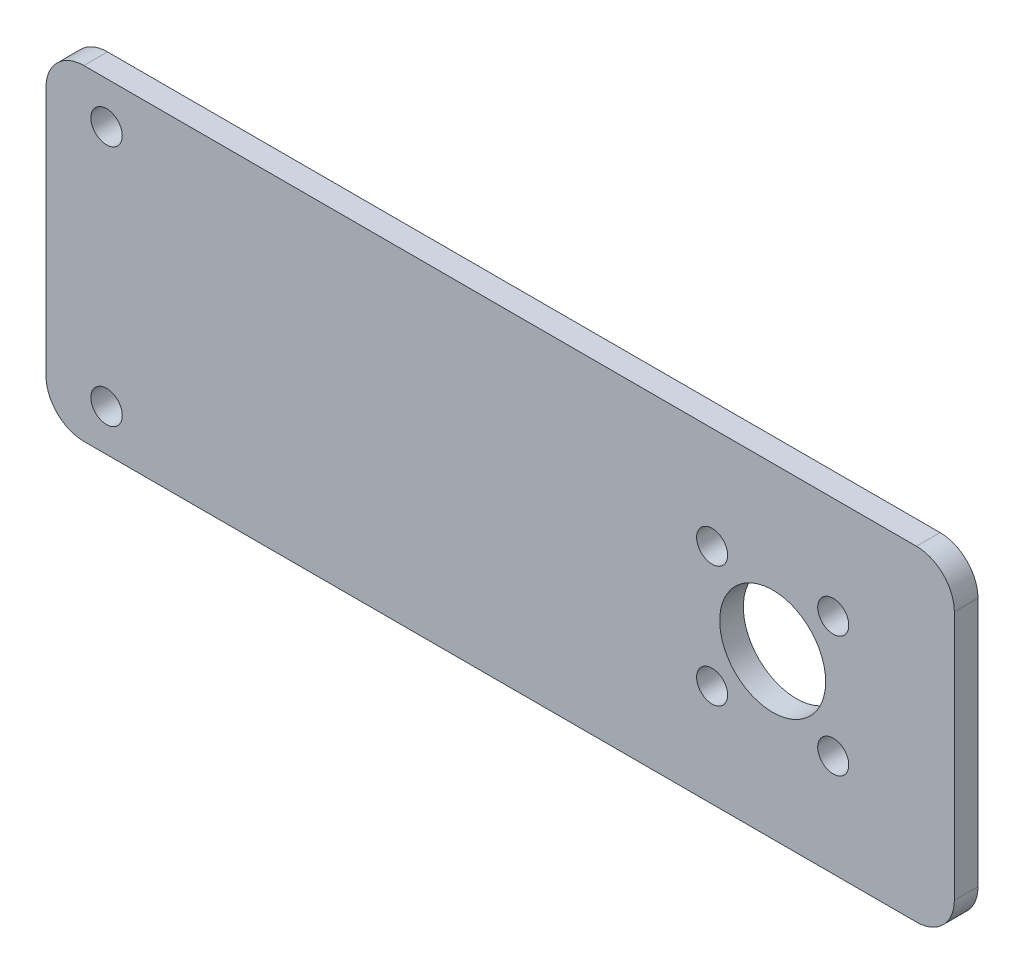
ISO-10303-21;
HEADER;
FILE_DESCRIPTION(('STEP AP214'),'2;1');
FILE_NAME('part.step','',(''),(''),'','','');
FILE_SCHEMA(('AUTOMOTIVE_DESIGN { 1 0 10303 214 1 1 1 1 }'));
ENDSEC;
DATA;
#1=APPLICATION_CONTEXT('core data for automotive mechanical design processes');
#2=APPLICATION_PROTOCOL_DEFINITION('international standard','automotive_design',2000,#1);
#3=PRODUCT_CONTEXT('',#1,'mechanical');
#4=PRODUCT('Part','Part','',(#3));
#5=PRODUCT_RELATED_PRODUCT_CATEGORY('part','',(#4));
#6=PRODUCT_DEFINITION_FORMATION('','',#4);
#7=PRODUCT_DEFINITION_CONTEXT('part definition',#1,'design');
#8=PRODUCT_DEFINITION('design','',#6,#7);
#9=PRODUCT_DEFINITION_SHAPE('','',#8);
#10=(LENGTH_UNIT() NAMED_UNIT(*) SI_UNIT(.MILLI.,.METRE.));
#11=(NAMED_UNIT(*) PLANE_ANGLE_UNIT() SI_UNIT($,.RADIAN.));
#12=(NAMED_UNIT(*) SI_UNIT($,.STERADIAN.) SOLID_ANGLE_UNIT());
#13=UNCERTAINTY_MEASURE_WITH_UNIT(LENGTH_MEASURE(1.E-05),#10,'distance_accuracy_value','');
#14=(GEOMETRIC_REPRESENTATION_CONTEXT(3) GLOBAL_UNCERTAINTY_ASSIGNED_CONTEXT((#13)) GLOBAL_UNIT_ASSIGNED_CONTEXT((#10,
#11,#12)) REPRESENTATION_CONTEXT('',''));
#15=CARTESIAN_POINT('',(0.,0.,0.));
#16=DIRECTION('',(0.,0.,1.));
#17=DIRECTION('',(1.,0.,0.));
#18=AXIS2_PLACEMENT_3D('',#15,#16,#17);
#19=CARTESIAN_POINT('',(0.,0.,3.125));
#20=DIRECTION('',(0.,0.,1.));
#21=DIRECTION('',(1.,0.,0.));
#22=AXIS2_PLACEMENT_3D('',#19,#20,#21);
#23=PLANE('',#22);
#24=CARTESIAN_POINT('',(44.,-8.00000000000001,3.125));
#25=DIRECTION('',(0.,0.,1.));
#26=DIRECTION('',(1.,0.,0.));
#27=AXIS2_PLACEMENT_3D('',#24,#25,#26);
#28=CIRCLE('',#27,2.05);
#29=CARTESIAN_POINT('',(46.05,-8.00000000000001,3.125));
#30=VERTEX_POINT('',#29);
#31=EDGE_CURVE('E199',#30,#30,#28,.T.);
#32=ORIENTED_EDGE('',*,*,#31,.F.);
#33=EDGE_LOOP('',(#32));
#34=FACE_BOUND('',#33,.T.);
#35=CARTESIAN_POINT('',(28.,7.99999999999999,3.125));
#36=DIRECTION('',(0.,0.,1.));
#37=DIRECTION('',(1.,0.,0.));
#38=AXIS2_PLACEMENT_3D('',#35,#36,#37);
#39=CIRCLE('',#38,2.05);
#40=CARTESIAN_POINT('',(30.05,7.99999999999999,3.125));
#41=VERTEX_POINT('',#40);
#42=EDGE_CURVE('E187',#41,#41,#39,.T.);
#43=ORIENTED_EDGE('',*,*,#42,.F.);
#44=EDGE_LOOP('',(#43));
#45=FACE_BOUND('',#44,.T.);
#46=CARTESIAN_POINT('',(-52.,-16.,3.125));
#47=DIRECTION('',(0.,0.,1.));
#48=DIRECTION('',(1.,0.,0.));
#49=AXIS2_PLACEMENT_3D('',#46,#47,#48);
#50=CIRCLE('',#49,2.075);
#51=CARTESIAN_POINT('',(-49.925,-16.,3.125));
#52=VERTEX_POINT('',#51);
#53=EDGE_CURVE('E176',#52,#52,#50,.T.);
#54=ORIENTED_EDGE('',*,*,#53,.F.);
#55=EDGE_LOOP('',(#54));
#56=FACE_BOUND('',#55,.T.);
#57=DIRECTION('',(1.,0.,0.));
#58=VECTOR('',#57,1.);
#59=CARTESIAN_POINT('',(60.,-21.5,3.125));
#60=LINE('',#59,#58);
#61=CARTESIAN_POINT('',(-55.,-21.5,3.125));
#62=VERTEX_POINT('',#61);
#63=CARTESIAN_POINT('',(55.,-21.5,3.125));
#64=VERTEX_POINT('',#63);
#65=EDGE_CURVE('E171',#62,#64,#60,.T.);
#66=ORIENTED_EDGE('',*,*,#65,.T.);
#67=CARTESIAN_POINT('',(55.,-16.5,3.125));
#68=DIRECTION('',(0.,0.,1.));
#69=DIRECTION('',(1.,0.,0.));
#70=AXIS2_PLACEMENT_3D('',#67,#68,#69);
#71=CIRCLE('',#70,5.);
#72=CARTESIAN_POINT('',(60.,-16.5,3.125));
#73=VERTEX_POINT('',#72);
#74=EDGE_CURVE('E148',#64,#73,#71,.T.);
#75=ORIENTED_EDGE('',*,*,#74,.T.);
#76=DIRECTION('',(0.,1.,0.));
#77=VECTOR('',#76,1.);
#78=CARTESIAN_POINT('',(60.,-21.5,3.125));
#79=LINE('',#78,#77);
#80=CARTESIAN_POINT('',(60.,16.5,3.125));
#81=VERTEX_POINT('',#80);
#82=EDGE_CURVE('E118',#73,#81,#79,.T.);
#83=ORIENTED_EDGE('',*,*,#82,.T.);
#84=CARTESIAN_POINT('',(55.,16.5,3.125));
#85=DIRECTION('',(0.,0.,1.));
#86=DIRECTION('',(1.,0.,0.));
#87=AXIS2_PLACEMENT_3D('',#84,#85,#86);
#88=CIRCLE('',#87,5.);
#89=CARTESIAN_POINT('',(55.,21.5,3.125));
#90=VERTEX_POINT('',#89);
#91=EDGE_CURVE('E55',#81,#90,#88,.T.);
#92=ORIENTED_EDGE('',*,*,#91,.T.);
#93=DIRECTION('',(-1.,0.,0.));
#94=VECTOR('',#93,1.);
#95=CARTESIAN_POINT('',(60.,21.5,3.125));
#96=LINE('',#95,#94);
#97=CARTESIAN_POINT('',(-55.,21.5,3.125));
#98=VERTEX_POINT('',#97);
#99=EDGE_CURVE('E134',#90,#98,#96,.T.);
#100=ORIENTED_EDGE('',*,*,#99,.T.);
#101=CARTESIAN_POINT('',(-55.,16.5,3.125));
#102=DIRECTION('',(0.,0.,1.));
#103=DIRECTION('',(1.,0.,0.));
#104=AXIS2_PLACEMENT_3D('',#101,#102,#103);
#105=CIRCLE('',#104,5.);
#106=CARTESIAN_POINT('',(-60.,16.5,3.125));
#107=VERTEX_POINT('',#106);
#108=EDGE_CURVE('E143',#98,#107,#105,.T.);
#109=ORIENTED_EDGE('',*,*,#108,.T.);
#110=DIRECTION('',(0.,-1.,0.));
#111=VECTOR('',#110,1.);
#112=CARTESIAN_POINT('',(-60.,-21.5,3.125));
#113=LINE('',#112,#111);
#114=CARTESIAN_POINT('',(-60.,-16.5,3.125));
#115=VERTEX_POINT('',#114);
#116=EDGE_CURVE('E128',#107,#115,#113,.T.);
#117=ORIENTED_EDGE('',*,*,#116,.T.);
#118=CARTESIAN_POINT('',(-55.,-16.5,3.125));
#119=DIRECTION('',(0.,0.,1.));
#120=DIRECTION('',(1.,0.,0.));
#121=AXIS2_PLACEMENT_3D('',#118,#119,#120);
#122=CIRCLE('',#121,5.);
#123=EDGE_CURVE('E145',#115,#62,#122,.T.);
#124=ORIENTED_EDGE('',*,*,#123,.T.);
#125=EDGE_LOOP('',(#66,#75,#83,#92,#100,#109,#117,#124));
#126=FACE_BOUND('',#125,.T.);
#127=CARTESIAN_POINT('',(-52.,16.,3.125));
#128=DIRECTION('',(0.,0.,1.));
#129=DIRECTION('',(1.,0.,0.));
#130=AXIS2_PLACEMENT_3D('',#127,#128,#129);
#131=CIRCLE('',#130,2.075);
#132=CARTESIAN_POINT('',(-49.925,16.,3.125));
#133=VERTEX_POINT('',#132);
#134=EDGE_CURVE('E164',#133,#133,#131,.T.);
#135=ORIENTED_EDGE('',*,*,#134,.F.);
#136=EDGE_LOOP('',(#135));
#137=FACE_BOUND('',#136,.T.);
#138=CARTESIAN_POINT('',(36.,0.,3.125));
#139=DIRECTION('',(0.,0.,1.));
#140=DIRECTION('',(1.,0.,0.));
#141=AXIS2_PLACEMENT_3D('',#138,#139,#140);
#142=CIRCLE('',#141,7.);
#143=CARTESIAN_POINT('',(43.,0.,3.125));
#144=VERTEX_POINT('',#143);
#145=EDGE_CURVE('E181',#144,#144,#142,.T.);
#146=ORIENTED_EDGE('',*,*,#145,.F.);
#147=EDGE_LOOP('',(#146));
#148=FACE_BOUND('',#147,.T.);
#149=CARTESIAN_POINT('',(44.,7.99999999999999,3.125));
#150=DIRECTION('',(0.,0.,1.));
#151=DIRECTION('',(1.,0.,0.));
#152=AXIS2_PLACEMENT_3D('',#149,#150,#151);
#153=CIRCLE('',#152,2.05);
#154=CARTESIAN_POINT('',(46.05,7.99999999999999,3.125));
#155=VERTEX_POINT('',#154);
#156=EDGE_CURVE('E193',#155,#155,#153,.T.);
#157=ORIENTED_EDGE('',*,*,#156,.F.);
#158=EDGE_LOOP('',(#157));
#159=FACE_BOUND('',#158,.T.);
#160=CARTESIAN_POINT('',(28.,-8.00000000000001,3.125));
#161=DIRECTION('',(0.,0.,1.));
#162=DIRECTION('',(1.,0.,0.));
#163=AXIS2_PLACEMENT_3D('',#160,#161,#162);
#164=CIRCLE('',#163,2.05);
#165=CARTESIAN_POINT('',(30.05,-8.00000000000001,3.125));
#166=VERTEX_POINT('',#165);
#167=EDGE_CURVE('E205',#166,#166,#164,.T.);
#168=ORIENTED_EDGE('',*,*,#167,.F.);
#169=EDGE_LOOP('',(#168));
#170=FACE_BOUND('',#169,.T.);
#171=ADVANCED_FACE('F33',(#34,#45,#56,#126,#137,#148,#159,#170),#23,.T.);
#172=CARTESIAN_POINT('',(0.,0.,0.));
#173=DIRECTION('',(0.,0.,1.));
#174=DIRECTION('',(1.,0.,0.));
#175=AXIS2_PLACEMENT_3D('',#172,#173,#174);
#176=PLANE('',#175);
#177=DIRECTION('',(0.,1.,0.));
#178=VECTOR('',#177,1.);
#179=CARTESIAN_POINT('',(60.,-21.5,0.));
#180=LINE('',#179,#178);
#181=CARTESIAN_POINT('',(60.,-16.5,0.));
#182=VERTEX_POINT('',#181);
#183=CARTESIAN_POINT('',(60.,16.5,0.));
#184=VERTEX_POINT('',#183);
#185=EDGE_CURVE('E116',#182,#184,#180,.T.);
#186=ORIENTED_EDGE('',*,*,#185,.F.);
#187=CARTESIAN_POINT('',(55.,-16.5,0.));
#188=DIRECTION('',(0.,0.,1.));
#189=DIRECTION('',(1.,0.,0.));
#190=AXIS2_PLACEMENT_3D('',#187,#188,#189);
#191=CIRCLE('',#190,5.);
#192=CARTESIAN_POINT('',(55.,-21.5,0.));
#193=VERTEX_POINT('',#192);
#194=EDGE_CURVE('E99',#182,#193,#191,.F.);
#195=ORIENTED_EDGE('',*,*,#194,.T.);
#196=DIRECTION('',(1.,0.,0.));
#197=VECTOR('',#196,1.);
#198=CARTESIAN_POINT('',(60.,-21.5,0.));
#199=LINE('',#198,#197);
#200=CARTESIAN_POINT('',(-55.,-21.5,0.));
#201=VERTEX_POINT('',#200);
#202=EDGE_CURVE('E126',#201,#193,#199,.T.);
#203=ORIENTED_EDGE('',*,*,#202,.F.);
#204=CARTESIAN_POINT('',(-55.,-16.5,0.));
#205=DIRECTION('',(0.,0.,1.));
#206=DIRECTION('',(1.,0.,0.));
#207=AXIS2_PLACEMENT_3D('',#204,#205,#206);
#208=CIRCLE('',#207,5.);
#209=CARTESIAN_POINT('',(-60.,-16.5,0.));
#210=VERTEX_POINT('',#209);
#211=EDGE_CURVE('E137',#201,#210,#208,.F.);
#212=ORIENTED_EDGE('',*,*,#211,.T.);
#213=DIRECTION('',(0.,-1.,0.));
#214=VECTOR('',#213,1.);
#215=CARTESIAN_POINT('',(-60.,-21.5,0.));
#216=LINE('',#215,#214);
#217=CARTESIAN_POINT('',(-60.,16.5,0.));
#218=VERTEX_POINT('',#217);
#219=EDGE_CURVE('E130',#218,#210,#216,.T.);
#220=ORIENTED_EDGE('',*,*,#219,.F.);
#221=CARTESIAN_POINT('',(-55.,16.5,0.));
#222=DIRECTION('',(0.,0.,1.));
#223=DIRECTION('',(1.,0.,0.));
#224=AXIS2_PLACEMENT_3D('',#221,#222,#223);
#225=CIRCLE('',#224,5.);
#226=CARTESIAN_POINT('',(-55.,21.5,0.));
#227=VERTEX_POINT('',#226);
#228=EDGE_CURVE('E119',#218,#227,#225,.F.);
#229=ORIENTED_EDGE('',*,*,#228,.T.);
#230=DIRECTION('',(-1.,0.,0.));
#231=VECTOR('',#230,1.);
#232=CARTESIAN_POINT('',(60.,21.5,0.));
#233=LINE('',#232,#231);
#234=CARTESIAN_POINT('',(55.,21.5,0.));
#235=VERTEX_POINT('',#234);
#236=EDGE_CURVE('E125',#235,#227,#233,.T.);
#237=ORIENTED_EDGE('',*,*,#236,.F.);
#238=CARTESIAN_POINT('',(55.,16.5,0.));
#239=DIRECTION('',(0.,0.,1.));
#240=DIRECTION('',(1.,0.,0.));
#241=AXIS2_PLACEMENT_3D('',#238,#239,#240);
#242=CIRCLE('',#241,5.);
#243=EDGE_CURVE('E110',#235,#184,#242,.F.);
#244=ORIENTED_EDGE('',*,*,#243,.T.);
#245=EDGE_LOOP('',(#186,#195,#203,#212,#220,#229,#237,#244));
#246=FACE_BOUND('',#245,.T.);
#247=CARTESIAN_POINT('',(-52.,16.,0.));
#248=DIRECTION('',(0.,0.,1.));
#249=DIRECTION('',(1.,0.,0.));
#250=AXIS2_PLACEMENT_3D('',#247,#248,#249);
#251=CIRCLE('',#250,2.075);
#252=CARTESIAN_POINT('',(-49.925,16.,0.));
#253=VERTEX_POINT('',#252);
#254=EDGE_CURVE('E166',#253,#253,#251,.T.);
#255=ORIENTED_EDGE('',*,*,#254,.T.);
#256=EDGE_LOOP('',(#255));
#257=FACE_BOUND('',#256,.T.);
#258=CARTESIAN_POINT('',(-52.,-16.,0.));
#259=DIRECTION('',(0.,0.,1.));
#260=DIRECTION('',(1.,0.,0.));
#261=AXIS2_PLACEMENT_3D('',#258,#259,#260);
#262=CIRCLE('',#261,2.075);
#263=CARTESIAN_POINT('',(-49.925,-16.,0.));
#264=VERTEX_POINT('',#263);
#265=EDGE_CURVE('E178',#264,#264,#262,.T.);
#266=ORIENTED_EDGE('',*,*,#265,.T.);
#267=EDGE_LOOP('',(#266));
#268=FACE_BOUND('',#267,.T.);
#269=CARTESIAN_POINT('',(36.,0.,0.));
#270=DIRECTION('',(0.,0.,1.));
#271=DIRECTION('',(1.,0.,0.));
#272=AXIS2_PLACEMENT_3D('',#269,#270,#271);
#273=CIRCLE('',#272,7.);
#274=CARTESIAN_POINT('',(43.,0.,0.));
#275=VERTEX_POINT('',#274);
#276=EDGE_CURVE('E184',#275,#275,#273,.T.);
#277=ORIENTED_EDGE('',*,*,#276,.T.);
#278=EDGE_LOOP('',(#277));
#279=FACE_BOUND('',#278,.T.);
#280=CARTESIAN_POINT('',(28.,7.99999999999999,0.));
#281=DIRECTION('',(0.,0.,1.));
#282=DIRECTION('',(1.,0.,0.));
#283=AXIS2_PLACEMENT_3D('',#280,#281,#282);
#284=CIRCLE('',#283,2.05);
#285=CARTESIAN_POINT('',(30.05,7.99999999999999,0.));
#286=VERTEX_POINT('',#285);
#287=EDGE_CURVE('E190',#286,#286,#284,.T.);
#288=ORIENTED_EDGE('',*,*,#287,.T.);
#289=EDGE_LOOP('',(#288));
#290=FACE_BOUND('',#289,.T.);
#291=CARTESIAN_POINT('',(44.,7.99999999999999,0.));
#292=DIRECTION('',(0.,0.,1.));
#293=DIRECTION('',(1.,0.,0.));
#294=AXIS2_PLACEMENT_3D('',#291,#292,#293);
#295=CIRCLE('',#294,2.05);
#296=CARTESIAN_POINT('',(46.05,7.99999999999999,0.));
#297=VERTEX_POINT('',#296);
#298=EDGE_CURVE('E196',#297,#297,#295,.T.);
#299=ORIENTED_EDGE('',*,*,#298,.T.);
#300=EDGE_LOOP('',(#299));
#301=FACE_BOUND('',#300,.T.);
#302=CARTESIAN_POINT('',(44.,-8.00000000000001,0.));
#303=DIRECTION('',(0.,0.,1.));
#304=DIRECTION('',(1.,0.,0.));
#305=AXIS2_PLACEMENT_3D('',#302,#303,#304);
#306=CIRCLE('',#305,2.05);
#307=CARTESIAN_POINT('',(46.05,-8.00000000000001,0.));
#308=VERTEX_POINT('',#307);
#309=EDGE_CURVE('E202',#308,#308,#306,.T.);
#310=ORIENTED_EDGE('',*,*,#309,.T.);
#311=EDGE_LOOP('',(#310));
#312=FACE_BOUND('',#311,.T.);
#313=CARTESIAN_POINT('',(28.,-8.00000000000001,0.));
#314=DIRECTION('',(0.,0.,1.));
#315=DIRECTION('',(1.,0.,0.));
#316=AXIS2_PLACEMENT_3D('',#313,#314,#315);
#317=CIRCLE('',#316,2.05);
#318=CARTESIAN_POINT('',(30.05,-8.00000000000001,0.));
#319=VERTEX_POINT('',#318);
#320=EDGE_CURVE('E208',#319,#319,#317,.T.);
#321=ORIENTED_EDGE('',*,*,#320,.T.);
#322=EDGE_LOOP('',(#321));
#323=FACE_BOUND('',#322,.T.);
#324=ADVANCED_FACE('F122',(#246,#257,#268,#279,#290,#301,#312,#323),#176,.F.);
#325=CARTESIAN_POINT('',(-60.,-21.5,3.125));
#326=DIRECTION('',(1.,0.,0.));
#327=DIRECTION('',(0.,0.,-1.));
#328=AXIS2_PLACEMENT_3D('',#325,#326,#327);
#329=PLANE('',#328);
#330=ORIENTED_EDGE('',*,*,#219,.T.);
#331=DIRECTION('',(0.,0.,-1.));
#332=VECTOR('',#331,1.);
#333=CARTESIAN_POINT('',(-60.,-16.5,3.125));
#334=LINE('',#333,#332);
#335=EDGE_CURVE('E11',#210,#115,#334,.F.);
#336=ORIENTED_EDGE('',*,*,#335,.T.);
#337=ORIENTED_EDGE('',*,*,#116,.F.);
#338=DIRECTION('',(0.,0.,-1.));
#339=VECTOR('',#338,1.);
#340=CARTESIAN_POINT('',(-60.,16.5,3.125));
#341=LINE('',#340,#339);
#342=EDGE_CURVE('E41',#107,#218,#341,.T.);
#343=ORIENTED_EDGE('',*,*,#342,.T.);
#344=EDGE_LOOP('',(#330,#336,#337,#343));
#345=FACE_BOUND('',#344,.T.);
#346=ADVANCED_FACE('F159',(#345),#329,.F.);
#347=CARTESIAN_POINT('',(60.,-21.5,3.125));
#348=DIRECTION('',(0.,1.,0.));
#349=DIRECTION('',(0.,0.,1.));
#350=AXIS2_PLACEMENT_3D('',#347,#348,#349);
#351=PLANE('',#350);
#352=ORIENTED_EDGE('',*,*,#202,.T.);
#353=DIRECTION('',(0.,0.,-1.));
#354=VECTOR('',#353,1.);
#355=CARTESIAN_POINT('',(55.,-21.5,3.125));
#356=LINE('',#355,#354);
#357=EDGE_CURVE('E104',#193,#64,#356,.F.);
#358=ORIENTED_EDGE('',*,*,#357,.T.);
#359=ORIENTED_EDGE('',*,*,#65,.F.);
#360=DIRECTION('',(0.,0.,-1.));
#361=VECTOR('',#360,1.);
#362=CARTESIAN_POINT('',(-55.,-21.5,3.125));
#363=LINE('',#362,#361);
#364=EDGE_CURVE('E109',#62,#201,#363,.T.);
#365=ORIENTED_EDGE('',*,*,#364,.T.);
#366=EDGE_LOOP('',(#352,#358,#359,#365));
#367=FACE_BOUND('',#366,.T.);
#368=ADVANCED_FACE('F235',(#367),#351,.F.);
#369=CARTESIAN_POINT('',(60.,-21.5,3.125));
#370=DIRECTION('',(-1.,0.,0.));
#371=DIRECTION('',(0.,0.,1.));
#372=AXIS2_PLACEMENT_3D('',#369,#370,#371);
#373=PLANE('',#372);
#374=ORIENTED_EDGE('',*,*,#82,.F.);
#375=DIRECTION('',(0.,0.,-1.));
#376=VECTOR('',#375,1.);
#377=CARTESIAN_POINT('',(60.,-16.5,3.125));
#378=LINE('',#377,#376);
#379=EDGE_CURVE('E103',#73,#182,#378,.T.);
#380=ORIENTED_EDGE('',*,*,#379,.T.);
#381=ORIENTED_EDGE('',*,*,#185,.T.);
#382=DIRECTION('',(0.,0.,-1.));
#383=VECTOR('',#382,1.);
#384=CARTESIAN_POINT('',(60.,16.5,3.125));
#385=LINE('',#384,#383);
#386=EDGE_CURVE('E120',#184,#81,#385,.F.);
#387=ORIENTED_EDGE('',*,*,#386,.T.);
#388=EDGE_LOOP('',(#374,#380,#381,#387));
#389=FACE_BOUND('',#388,.T.);
#390=ADVANCED_FACE('F115',(#389),#373,.F.);
#391=CARTESIAN_POINT('',(60.,21.5,3.125));
#392=DIRECTION('',(0.,-1.,0.));
#393=DIRECTION('',(0.,0.,-1.));
#394=AXIS2_PLACEMENT_3D('',#391,#392,#393);
#395=PLANE('',#394);
#396=ORIENTED_EDGE('',*,*,#99,.F.);
#397=DIRECTION('',(0.,0.,-1.));
#398=VECTOR('',#397,1.);
#399=CARTESIAN_POINT('',(55.,21.5,3.125));
#400=LINE('',#399,#398);
#401=EDGE_CURVE('E151',#90,#235,#400,.T.);
#402=ORIENTED_EDGE('',*,*,#401,.T.);
#403=ORIENTED_EDGE('',*,*,#236,.T.);
#404=DIRECTION('',(0.,0.,-1.));
#405=VECTOR('',#404,1.);
#406=CARTESIAN_POINT('',(-55.,21.5,3.125));
#407=LINE('',#406,#405);
#408=EDGE_CURVE('E48',#227,#98,#407,.F.);
#409=ORIENTED_EDGE('',*,*,#408,.T.);
#410=EDGE_LOOP('',(#396,#402,#403,#409));
#411=FACE_BOUND('',#410,.T.);
#412=ADVANCED_FACE('F230',(#411),#395,.F.);
#413=CARTESIAN_POINT('',(-52.,16.,3.125));
#414=DIRECTION('',(0.,0.,-1.));
#415=DIRECTION('',(-1.,0.,0.));
#416=AXIS2_PLACEMENT_3D('',#413,#414,#415);
#417=CYLINDRICAL_SURFACE('',#416,2.075);
#418=ORIENTED_EDGE('',*,*,#134,.T.);
#419=EDGE_LOOP('',(#418));
#420=FACE_BOUND('',#419,.T.);
#421=ORIENTED_EDGE('',*,*,#254,.F.);
#422=EDGE_LOOP('',(#421));
#423=FACE_BOUND('',#422,.T.);
#424=ADVANCED_FACE('F227',(#420,#423),#417,.F.);
#425=CARTESIAN_POINT('',(-52.,-16.,3.125));
#426=DIRECTION('',(0.,0.,-1.));
#427=DIRECTION('',(-1.,0.,0.));
#428=AXIS2_PLACEMENT_3D('',#425,#426,#427);
#429=CYLINDRICAL_SURFACE('',#428,2.075);
#430=ORIENTED_EDGE('',*,*,#53,.T.);
#431=EDGE_LOOP('',(#430));
#432=FACE_BOUND('',#431,.T.);
#433=ORIENTED_EDGE('',*,*,#265,.F.);
#434=EDGE_LOOP('',(#433));
#435=FACE_BOUND('',#434,.T.);
#436=ADVANCED_FACE('F288',(#432,#435),#429,.F.);
#437=CARTESIAN_POINT('',(36.,0.,3.125));
#438=DIRECTION('',(0.,0.,-1.));
#439=DIRECTION('',(-1.,0.,0.));
#440=AXIS2_PLACEMENT_3D('',#437,#438,#439);
#441=CYLINDRICAL_SURFACE('',#440,7.);
#442=ORIENTED_EDGE('',*,*,#145,.T.);
#443=EDGE_LOOP('',(#442));
#444=FACE_BOUND('',#443,.T.);
#445=ORIENTED_EDGE('',*,*,#276,.F.);
#446=EDGE_LOOP('',(#445));
#447=FACE_BOUND('',#446,.T.);
#448=ADVANCED_FACE('F285',(#444,#447),#441,.F.);
#449=CARTESIAN_POINT('',(28.,7.99999999999999,3.125));
#450=DIRECTION('',(0.,0.,-1.));
#451=DIRECTION('',(-1.,0.,0.));
#452=AXIS2_PLACEMENT_3D('',#449,#450,#451);
#453=CYLINDRICAL_SURFACE('',#452,2.05);
#454=ORIENTED_EDGE('',*,*,#42,.T.);
#455=EDGE_LOOP('',(#454));
#456=FACE_BOUND('',#455,.T.);
#457=ORIENTED_EDGE('',*,*,#287,.F.);
#458=EDGE_LOOP('',(#457));
#459=FACE_BOUND('',#458,.T.);
#460=ADVANCED_FACE('F267',(#456,#459),#453,.F.);
#461=CARTESIAN_POINT('',(44.,7.99999999999999,3.125));
#462=DIRECTION('',(0.,0.,-1.));
#463=DIRECTION('',(-1.,0.,0.));
#464=AXIS2_PLACEMENT_3D('',#461,#462,#463);
#465=CYLINDRICAL_SURFACE('',#464,2.05);
#466=ORIENTED_EDGE('',*,*,#156,.T.);
#467=EDGE_LOOP('',(#466));
#468=FACE_BOUND('',#467,.T.);
#469=ORIENTED_EDGE('',*,*,#298,.F.);
#470=EDGE_LOOP('',(#469));
#471=FACE_BOUND('',#470,.T.);
#472=ADVANCED_FACE('F263',(#468,#471),#465,.F.);
#473=CARTESIAN_POINT('',(44.,-8.00000000000001,3.125));
#474=DIRECTION('',(0.,0.,-1.));
#475=DIRECTION('',(-1.,0.,0.));
#476=AXIS2_PLACEMENT_3D('',#473,#474,#475);
#477=CYLINDRICAL_SURFACE('',#476,2.05);
#478=ORIENTED_EDGE('',*,*,#31,.T.);
#479=EDGE_LOOP('',(#478));
#480=FACE_BOUND('',#479,.T.);
#481=ORIENTED_EDGE('',*,*,#309,.F.);
#482=EDGE_LOOP('',(#481));
#483=FACE_BOUND('',#482,.T.);
#484=ADVANCED_FACE('F266',(#480,#483),#477,.F.);
#485=CARTESIAN_POINT('',(28.,-8.00000000000001,3.125));
#486=DIRECTION('',(0.,0.,-1.));
#487=DIRECTION('',(-1.,0.,0.));
#488=AXIS2_PLACEMENT_3D('',#485,#486,#487);
#489=CYLINDRICAL_SURFACE('',#488,2.05);
#490=ORIENTED_EDGE('',*,*,#167,.T.);
#491=EDGE_LOOP('',(#490));
#492=FACE_BOUND('',#491,.T.);
#493=ORIENTED_EDGE('',*,*,#320,.F.);
#494=EDGE_LOOP('',(#493));
#495=FACE_BOUND('',#494,.T.);
#496=ADVANCED_FACE('F214',(#492,#495),#489,.F.);
#497=CARTESIAN_POINT('',(55.,-16.5,3.125));
#498=DIRECTION('',(0.,0.,-1.));
#499=DIRECTION('',(-1.,0.,0.));
#500=AXIS2_PLACEMENT_3D('',#497,#498,#499);
#501=CYLINDRICAL_SURFACE('',#500,5.);
#502=ORIENTED_EDGE('',*,*,#74,.F.);
#503=ORIENTED_EDGE('',*,*,#357,.F.);
#504=ORIENTED_EDGE('',*,*,#194,.F.);
#505=ORIENTED_EDGE('',*,*,#379,.F.);
#506=EDGE_LOOP('',(#502,#503,#504,#505));
#507=FACE_BOUND('',#506,.T.);
#508=ADVANCED_FACE('F102',(#507),#501,.T.);
#509=CARTESIAN_POINT('',(55.,16.5,3.125));
#510=DIRECTION('',(0.,0.,-1.));
#511=DIRECTION('',(-1.,0.,0.));
#512=AXIS2_PLACEMENT_3D('',#509,#510,#511);
#513=CYLINDRICAL_SURFACE('',#512,5.);
#514=ORIENTED_EDGE('',*,*,#91,.F.);
#515=ORIENTED_EDGE('',*,*,#386,.F.);
#516=ORIENTED_EDGE('',*,*,#243,.F.);
#517=ORIENTED_EDGE('',*,*,#401,.F.);
#518=EDGE_LOOP('',(#514,#515,#516,#517));
#519=FACE_BOUND('',#518,.T.);
#520=ADVANCED_FACE('F243',(#519),#513,.T.);
#521=CARTESIAN_POINT('',(-55.,-16.5,3.125));
#522=DIRECTION('',(0.,0.,-1.));
#523=DIRECTION('',(-1.,0.,0.));
#524=AXIS2_PLACEMENT_3D('',#521,#522,#523);
#525=CYLINDRICAL_SURFACE('',#524,5.);
#526=ORIENTED_EDGE('',*,*,#123,.F.);
#527=ORIENTED_EDGE('',*,*,#335,.F.);
#528=ORIENTED_EDGE('',*,*,#211,.F.);
#529=ORIENTED_EDGE('',*,*,#364,.F.);
#530=EDGE_LOOP('',(#526,#527,#528,#529));
#531=FACE_BOUND('',#530,.T.);
#532=ADVANCED_FACE('F245',(#531),#525,.T.);
#533=CARTESIAN_POINT('',(-55.,16.5,3.125));
#534=DIRECTION('',(0.,0.,-1.));
#535=DIRECTION('',(-1.,0.,0.));
#536=AXIS2_PLACEMENT_3D('',#533,#534,#535);
#537=CYLINDRICAL_SURFACE('',#536,5.);
#538=ORIENTED_EDGE('',*,*,#108,.F.);
#539=ORIENTED_EDGE('',*,*,#408,.F.);
#540=ORIENTED_EDGE('',*,*,#228,.F.);
#541=ORIENTED_EDGE('',*,*,#342,.F.);
#542=EDGE_LOOP('',(#538,#539,#540,#541));
#543=FACE_BOUND('',#542,.T.);
#544=ADVANCED_FACE('F35',(#543),#537,.T.);
#545=CLOSED_SHELL('',(#171,#324,#346,#368,#390,#412,#424,#436,#448,#460,#472,#484,#496,#508,
#520,#532,#544));
#546=MANIFOLD_SOLID_BREP('B2',#545);
#547=ADVANCED_BREP_SHAPE_REPRESENTATION('',(#18,#546),#14);
#548=SHAPE_DEFINITION_REPRESENTATION(#9,#547);
ENDSEC;
END-ISO-10303-21;
